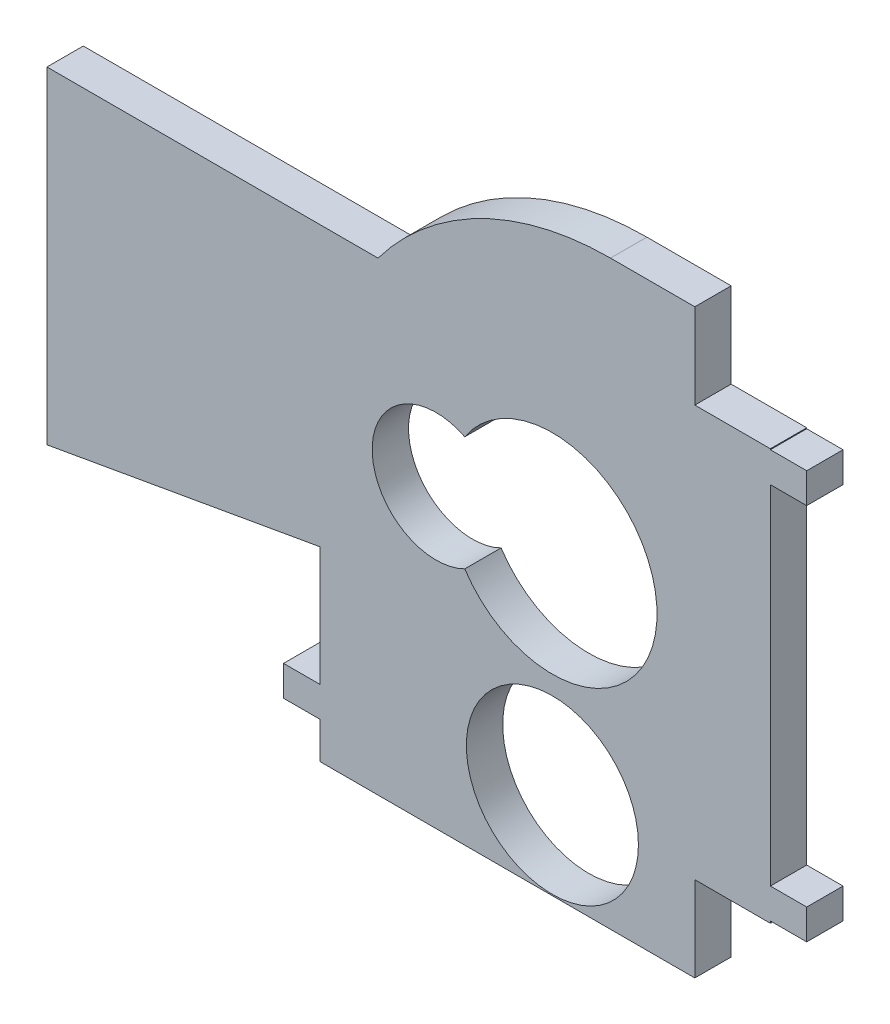
ISO-10303-21;
HEADER;
FILE_DESCRIPTION(('STEP AP214'),'2;1');
FILE_NAME('part.step','',(''),(''),'','','');
FILE_SCHEMA(('AUTOMOTIVE_DESIGN { 1 0 10303 214 1 1 1 1 }'));
ENDSEC;
DATA;
#1=APPLICATION_CONTEXT('core data for automotive mechanical design processes');
#2=APPLICATION_PROTOCOL_DEFINITION('international standard','automotive_design',2000,#1);
#3=PRODUCT_CONTEXT('',#1,'mechanical');
#4=PRODUCT('Part','Part','',(#3));
#5=PRODUCT_RELATED_PRODUCT_CATEGORY('part','',(#4));
#6=PRODUCT_DEFINITION_FORMATION('','',#4);
#7=PRODUCT_DEFINITION_CONTEXT('part definition',#1,'design');
#8=PRODUCT_DEFINITION('design','',#6,#7);
#9=PRODUCT_DEFINITION_SHAPE('','',#8);
#10=(LENGTH_UNIT() NAMED_UNIT(*) SI_UNIT(.MILLI.,.METRE.));
#11=(NAMED_UNIT(*) PLANE_ANGLE_UNIT() SI_UNIT($,.RADIAN.));
#12=(NAMED_UNIT(*) SI_UNIT($,.STERADIAN.) SOLID_ANGLE_UNIT());
#13=UNCERTAINTY_MEASURE_WITH_UNIT(LENGTH_MEASURE(1.E-05),#10,'distance_accuracy_value','');
#14=(GEOMETRIC_REPRESENTATION_CONTEXT(3) GLOBAL_UNCERTAINTY_ASSIGNED_CONTEXT((#13)) GLOBAL_UNIT_ASSIGNED_CONTEXT((#10,
#11,#12)) REPRESENTATION_CONTEXT('',''));
#15=CARTESIAN_POINT('',(0.,0.,0.));
#16=DIRECTION('',(0.,0.,1.));
#17=DIRECTION('',(1.,0.,0.));
#18=AXIS2_PLACEMENT_3D('',#15,#16,#17);
#19=CARTESIAN_POINT('',(-5.48621075951455,-23.7640869080621,1.5875));
#20=DIRECTION('',(0.,0.,1.));
#21=DIRECTION('',(1.,0.,0.));
#22=AXIS2_PLACEMENT_3D('',#19,#20,#21);
#23=PLANE('',#22);
#24=CARTESIAN_POINT('',(-5.08,9.144,1.5875));
#25=DIRECTION('',(0.,0.,1.));
#26=DIRECTION('',(1.,0.,0.));
#27=AXIS2_PLACEMENT_3D('',#24,#25,#26);
#28=CIRCLE('',#27,2.794);
#29=CARTESIAN_POINT('',(-3.82905,11.6423114492593,1.5875));
#30=VERTEX_POINT('',#29);
#31=CARTESIAN_POINT('',(-3.82905,6.64568855074072,1.5875));
#32=VERTEX_POINT('',#31);
#33=EDGE_CURVE('E253',#30,#32,#28,.T.);
#34=ORIENTED_EDGE('',*,*,#33,.F.);
#35=CARTESIAN_POINT('',(0.,9.144,1.5875));
#36=DIRECTION('',(0.,0.,1.));
#37=DIRECTION('',(1.,0.,0.));
#38=AXIS2_PLACEMENT_3D('',#35,#36,#37);
#39=CIRCLE('',#38,4.572);
#40=EDGE_CURVE('E256',#32,#30,#39,.T.);
#41=ORIENTED_EDGE('',*,*,#40,.F.);
#42=EDGE_LOOP('',(#34,#41));
#43=FACE_BOUND('',#42,.T.);
#44=CARTESIAN_POINT('',(0.,0.,1.5875));
#45=DIRECTION('',(0.,0.,1.));
#46=DIRECTION('',(1.,0.,0.));
#47=AXIS2_PLACEMENT_3D('',#44,#45,#46);
#48=CIRCLE('',#47,3.7592);
#49=CARTESIAN_POINT('',(3.7592,0.,1.5875));
#50=VERTEX_POINT('',#49);
#51=EDGE_CURVE('E260',#50,#50,#48,.T.);
#52=ORIENTED_EDGE('',*,*,#51,.F.);
#53=EDGE_LOOP('',(#52));
#54=FACE_BOUND('',#53,.T.);
#55=DIRECTION('',(1.,0.,0.));
#56=VECTOR('',#55,1.);
#57=CARTESIAN_POINT('',(-5.48621075951455,17.8689,1.5875));
#58=LINE('',#57,#56);
#59=CARTESIAN_POINT('',(6.22299999999988,17.8689,1.5875));
#60=VERTEX_POINT('',#59);
#61=CARTESIAN_POINT('',(9.52499999999987,17.8689,1.5875));
#62=VERTEX_POINT('',#61);
#63=EDGE_CURVE('E52',#60,#62,#58,.T.);
#64=ORIENTED_EDGE('',*,*,#63,.F.);
#65=DIRECTION('',(0.,1.,0.));
#66=VECTOR('',#65,1.);
#67=CARTESIAN_POINT('',(6.22299999999989,-23.7640869080621,1.5875));
#68=LINE('',#67,#66);
#69=CARTESIAN_POINT('',(6.22299999999988,21.59,1.5875));
#70=VERTEX_POINT('',#69);
#71=EDGE_CURVE('E215',#60,#70,#68,.T.);
#72=ORIENTED_EDGE('',*,*,#71,.T.);
#73=DIRECTION('',(1.,0.,0.));
#74=VECTOR('',#73,1.);
#75=CARTESIAN_POINT('',(-5.48621075951453,21.59,1.5875));
#76=LINE('',#75,#74);
#77=CARTESIAN_POINT('',(2.53999999999988,21.59,1.5875));
#78=VERTEX_POINT('',#77);
#79=EDGE_CURVE('E263',#78,#70,#76,.T.);
#80=ORIENTED_EDGE('',*,*,#79,.F.);
#81=CARTESIAN_POINT('',(2.53999999999988,8.89,1.5875));
#82=DIRECTION('',(0.,0.,1.));
#83=DIRECTION('',(1.,0.,0.));
#84=AXIS2_PLACEMENT_3D('',#81,#82,#83);
#85=CIRCLE('',#84,12.7);
#86=CARTESIAN_POINT('',(-7.62000000000013,16.51,1.5875));
#87=VERTEX_POINT('',#86);
#88=EDGE_CURVE('E266',#78,#87,#85,.T.);
#89=ORIENTED_EDGE('',*,*,#88,.T.);
#90=DIRECTION('',(-1.,0.,0.));
#91=VECTOR('',#90,1.);
#92=CARTESIAN_POINT('',(-5.48621075951456,16.51,1.5875));
#93=LINE('',#92,#91);
#94=CARTESIAN_POINT('',(-22.0849215190291,16.51,1.5875));
#95=VERTEX_POINT('',#94);
#96=EDGE_CURVE('E269',#87,#95,#93,.T.);
#97=ORIENTED_EDGE('',*,*,#96,.T.);
#98=DIRECTION('',(0.,-1.,0.));
#99=VECTOR('',#98,1.);
#100=CARTESIAN_POINT('',(-22.0849215190291,-23.7640869080621,1.5875));
#101=LINE('',#100,#99);
#102=CARTESIAN_POINT('',(-22.0849215190291,2.2120074123447,1.5875));
#103=VERTEX_POINT('',#102);
#104=EDGE_CURVE('E272',#95,#103,#101,.T.);
#105=ORIENTED_EDGE('',*,*,#104,.T.);
#106=DIRECTION('',(0.984761013296185,0.173913043478257,0.));
#107=VECTOR('',#106,1.);
#108=CARTESIAN_POINT('',(-10.4369894152438,4.26908247425937,1.5875));
#109=LINE('',#108,#107);
#110=CARTESIAN_POINT('',(-10.1600000000001,4.318,1.5875));
#111=VERTEX_POINT('',#110);
#112=EDGE_CURVE('E275',#103,#111,#109,.T.);
#113=ORIENTED_EDGE('',*,*,#112,.T.);
#114=DIRECTION('',(0.,-1.,0.));
#115=VECTOR('',#114,1.);
#116=CARTESIAN_POINT('',(-10.1600000000001,-23.7640869080621,1.5875));
#117=LINE('',#116,#115);
#118=CARTESIAN_POINT('',(-10.1600000000001,-0.889000000000001,1.5875));
#119=VERTEX_POINT('',#118);
#120=EDGE_CURVE('E278',#111,#119,#117,.T.);
#121=ORIENTED_EDGE('',*,*,#120,.T.);
#122=DIRECTION('',(1.,0.,0.));
#123=VECTOR('',#122,1.);
#124=CARTESIAN_POINT('',(-5.48621075951455,-0.889000000000001,1.5875));
#125=LINE('',#124,#123);
#126=CARTESIAN_POINT('',(-11.7475000000001,-0.889000000000001,1.5875));
#127=VERTEX_POINT('',#126);
#128=EDGE_CURVE('E280',#127,#119,#125,.T.);
#129=ORIENTED_EDGE('',*,*,#128,.F.);
#130=DIRECTION('',(0.,1.,0.));
#131=VECTOR('',#130,1.);
#132=CARTESIAN_POINT('',(-11.7475000000001,-23.7640869080621,1.5875));
#133=LINE('',#132,#131);
#134=CARTESIAN_POINT('',(-11.7475000000001,-2.2098,1.5875));
#135=VERTEX_POINT('',#134);
#136=EDGE_CURVE('E284',#135,#127,#133,.T.);
#137=ORIENTED_EDGE('',*,*,#136,.F.);
#138=DIRECTION('',(1.,0.,0.));
#139=VECTOR('',#138,1.);
#140=CARTESIAN_POINT('',(-5.48621075951455,-2.2098,1.5875));
#141=LINE('',#140,#139);
#142=CARTESIAN_POINT('',(-10.1600000000001,-2.2098,1.5875));
#143=VERTEX_POINT('',#142);
#144=EDGE_CURVE('E287',#135,#143,#141,.T.);
#145=ORIENTED_EDGE('',*,*,#144,.T.);
#146=CARTESIAN_POINT('',(-10.1600000000001,-3.81,1.5875));
#147=VERTEX_POINT('',#146);
#148=EDGE_CURVE('E281',#143,#147,#117,.T.);
#149=ORIENTED_EDGE('',*,*,#148,.T.);
#150=DIRECTION('',(1.,0.,0.));
#151=VECTOR('',#150,1.);
#152=CARTESIAN_POINT('',(-5.48621075951455,-3.81,1.5875));
#153=LINE('',#152,#151);
#154=CARTESIAN_POINT('',(6.22299999999988,-3.81,1.5875));
#155=VERTEX_POINT('',#154);
#156=EDGE_CURVE('E290',#147,#155,#153,.T.);
#157=ORIENTED_EDGE('',*,*,#156,.T.);
#158=DIRECTION('',(0.,1.,0.));
#159=VECTOR('',#158,1.);
#160=CARTESIAN_POINT('',(6.22299999999988,-23.7640869080621,1.5875));
#161=LINE('',#160,#159);
#162=CARTESIAN_POINT('',(6.22299999999988,-0.0889000000000133,1.5875));
#163=VERTEX_POINT('',#162);
#164=EDGE_CURVE('E242',#155,#163,#161,.T.);
#165=ORIENTED_EDGE('',*,*,#164,.T.);
#166=DIRECTION('',(1.,0.,0.));
#167=VECTOR('',#166,1.);
#168=CARTESIAN_POINT('',(-5.48621075951455,-0.0889000000000098,1.5875));
#169=LINE('',#168,#167);
#170=CARTESIAN_POINT('',(9.52499999999988,-0.0889000000000098,1.5875));
#171=VERTEX_POINT('',#170);
#172=EDGE_CURVE('E239',#163,#171,#169,.T.);
#173=ORIENTED_EDGE('',*,*,#172,.T.);
#174=DIRECTION('',(0.,-1.,0.));
#175=VECTOR('',#174,1.);
#176=CARTESIAN_POINT('',(9.52499999999988,-23.7640869080621,1.5875));
#177=LINE('',#176,#175);
#178=CARTESIAN_POINT('',(9.52499999999988,0.,1.5875));
#179=VERTEX_POINT('',#178);
#180=EDGE_CURVE('E293',#179,#171,#177,.T.);
#181=ORIENTED_EDGE('',*,*,#180,.F.);
#182=DIRECTION('',(1.,0.,0.));
#183=VECTOR('',#182,1.);
#184=CARTESIAN_POINT('',(-5.48621075951456,0.,1.5875));
#185=LINE('',#184,#183);
#186=CARTESIAN_POINT('',(11.1125,0.,1.5875));
#187=VERTEX_POINT('',#186);
#188=EDGE_CURVE('E296',#179,#187,#185,.T.);
#189=ORIENTED_EDGE('',*,*,#188,.T.);
#190=DIRECTION('',(0.,1.,0.));
#191=VECTOR('',#190,1.);
#192=CARTESIAN_POINT('',(11.1125,-23.7640869080621,1.5875));
#193=LINE('',#192,#191);
#194=CARTESIAN_POINT('',(11.1124999999999,1.3208,1.5875));
#195=VERTEX_POINT('',#194);
#196=EDGE_CURVE('E301',#187,#195,#193,.T.);
#197=ORIENTED_EDGE('',*,*,#196,.T.);
#198=DIRECTION('',(1.,0.,0.));
#199=VECTOR('',#198,1.);
#200=CARTESIAN_POINT('',(-5.48621075951455,1.3208,1.5875));
#201=LINE('',#200,#199);
#202=CARTESIAN_POINT('',(9.52499999999988,1.3208,1.5875));
#203=VERTEX_POINT('',#202);
#204=EDGE_CURVE('E303',#203,#195,#201,.T.);
#205=ORIENTED_EDGE('',*,*,#204,.F.);
#206=CARTESIAN_POINT('',(9.52499999999985,16.51,1.5875));
#207=VERTEX_POINT('',#206);
#208=EDGE_CURVE('E298',#207,#203,#177,.T.);
#209=ORIENTED_EDGE('',*,*,#208,.F.);
#210=DIRECTION('',(1.,0.,0.));
#211=VECTOR('',#210,1.);
#212=CARTESIAN_POINT('',(-5.48621075951455,16.51,1.5875));
#213=LINE('',#212,#211);
#214=CARTESIAN_POINT('',(11.1124999999999,16.51,1.5875));
#215=VERTEX_POINT('',#214);
#216=EDGE_CURVE('E306',#207,#215,#213,.T.);
#217=ORIENTED_EDGE('',*,*,#216,.T.);
#218=DIRECTION('',(0.,1.,0.));
#219=VECTOR('',#218,1.);
#220=CARTESIAN_POINT('',(11.1124999999999,-23.7640869080621,1.5875));
#221=LINE('',#220,#219);
#222=CARTESIAN_POINT('',(11.1124999999999,17.8308,1.5875));
#223=VERTEX_POINT('',#222);
#224=EDGE_CURVE('E309',#215,#223,#221,.T.);
#225=ORIENTED_EDGE('',*,*,#224,.T.);
#226=DIRECTION('',(1.,0.,0.));
#227=VECTOR('',#226,1.);
#228=CARTESIAN_POINT('',(-5.48621075951455,17.8308,1.5875));
#229=LINE('',#228,#227);
#230=CARTESIAN_POINT('',(9.52499999999987,17.8308,1.5875));
#231=VERTEX_POINT('',#230);
#232=EDGE_CURVE('E311',#231,#223,#229,.T.);
#233=ORIENTED_EDGE('',*,*,#232,.F.);
#234=EDGE_CURVE('E297',#62,#231,#177,.T.);
#235=ORIENTED_EDGE('',*,*,#234,.F.);
#236=EDGE_LOOP('',(#64,#72,#80,#89,#97,#105,#113,#121,#129,#137,#145,#149,#157,#165,#173,#181,
#189,#197,#205,#209,#217,#225,#233,#235));
#237=FACE_BOUND('',#236,.T.);
#238=ADVANCED_FACE('F35',(#43,#54,#237),#23,.T.);
#239=CARTESIAN_POINT('',(-5.48621075951455,-23.7640869080621,0.));
#240=DIRECTION('',(0.,0.,1.));
#241=DIRECTION('',(1.,0.,0.));
#242=AXIS2_PLACEMENT_3D('',#239,#240,#241);
#243=PLANE('',#242);
#244=CARTESIAN_POINT('',(-5.08,9.144,0.));
#245=DIRECTION('',(0.,0.,1.));
#246=DIRECTION('',(1.,0.,0.));
#247=AXIS2_PLACEMENT_3D('',#244,#245,#246);
#248=CIRCLE('',#247,2.794);
#249=CARTESIAN_POINT('',(-3.82905,11.6423114492593,0.));
#250=VERTEX_POINT('',#249);
#251=CARTESIAN_POINT('',(-3.82905,6.64568855074072,0.));
#252=VERTEX_POINT('',#251);
#253=EDGE_CURVE('E252',#250,#252,#248,.T.);
#254=ORIENTED_EDGE('',*,*,#253,.T.);
#255=CARTESIAN_POINT('',(0.,9.144,0.));
#256=DIRECTION('',(0.,0.,1.));
#257=DIRECTION('',(1.,0.,0.));
#258=AXIS2_PLACEMENT_3D('',#255,#256,#257);
#259=CIRCLE('',#258,4.572);
#260=EDGE_CURVE('E316',#252,#250,#259,.T.);
#261=ORIENTED_EDGE('',*,*,#260,.T.);
#262=EDGE_LOOP('',(#254,#261));
#263=FACE_BOUND('',#262,.T.);
#264=CARTESIAN_POINT('',(0.,0.,0.));
#265=DIRECTION('',(0.,0.,1.));
#266=DIRECTION('',(1.,0.,0.));
#267=AXIS2_PLACEMENT_3D('',#264,#265,#266);
#268=CIRCLE('',#267,3.7592);
#269=CARTESIAN_POINT('',(3.7592,0.,0.));
#270=VERTEX_POINT('',#269);
#271=EDGE_CURVE('E319',#270,#270,#268,.T.);
#272=ORIENTED_EDGE('',*,*,#271,.T.);
#273=EDGE_LOOP('',(#272));
#274=FACE_BOUND('',#273,.T.);
#275=DIRECTION('',(0.,-1.,0.));
#276=VECTOR('',#275,1.);
#277=CARTESIAN_POINT('',(6.22299999999989,-23.7640869080621,0.));
#278=LINE('',#277,#276);
#279=CARTESIAN_POINT('',(6.22299999999988,21.59,0.));
#280=VERTEX_POINT('',#279);
#281=CARTESIAN_POINT('',(6.22299999999988,17.8689,0.));
#282=VERTEX_POINT('',#281);
#283=EDGE_CURVE('E212',#280,#282,#278,.T.);
#284=ORIENTED_EDGE('',*,*,#283,.T.);
#285=DIRECTION('',(-1.,0.,0.));
#286=VECTOR('',#285,1.);
#287=CARTESIAN_POINT('',(-5.48621075951455,17.8689,0.));
#288=LINE('',#287,#286);
#289=CARTESIAN_POINT('',(9.52499999999988,17.8689,0.));
#290=VERTEX_POINT('',#289);
#291=EDGE_CURVE('E219',#290,#282,#288,.T.);
#292=ORIENTED_EDGE('',*,*,#291,.F.);
#293=DIRECTION('',(0.,-1.,0.));
#294=VECTOR('',#293,1.);
#295=CARTESIAN_POINT('',(9.52499999999988,-23.7640869080621,0.));
#296=LINE('',#295,#294);
#297=CARTESIAN_POINT('',(9.52499999999987,17.8308,0.));
#298=VERTEX_POINT('',#297);
#299=EDGE_CURVE('E257',#290,#298,#296,.T.);
#300=ORIENTED_EDGE('',*,*,#299,.T.);
#301=DIRECTION('',(1.,0.,0.));
#302=VECTOR('',#301,1.);
#303=CARTESIAN_POINT('',(-5.48621075951455,17.8308,0.));
#304=LINE('',#303,#302);
#305=CARTESIAN_POINT('',(11.1124999999999,17.8308,0.));
#306=VERTEX_POINT('',#305);
#307=EDGE_CURVE('E370',#298,#306,#304,.T.);
#308=ORIENTED_EDGE('',*,*,#307,.T.);
#309=DIRECTION('',(0.,1.,0.));
#310=VECTOR('',#309,1.);
#311=CARTESIAN_POINT('',(11.1124999999999,-23.7640869080621,0.));
#312=LINE('',#311,#310);
#313=CARTESIAN_POINT('',(11.1124999999999,16.51,0.));
#314=VERTEX_POINT('',#313);
#315=EDGE_CURVE('E367',#314,#306,#312,.T.);
#316=ORIENTED_EDGE('',*,*,#315,.F.);
#317=DIRECTION('',(1.,0.,0.));
#318=VECTOR('',#317,1.);
#319=CARTESIAN_POINT('',(-5.48621075951455,16.51,0.));
#320=LINE('',#319,#318);
#321=CARTESIAN_POINT('',(9.52499999999985,16.51,0.));
#322=VERTEX_POINT('',#321);
#323=EDGE_CURVE('E364',#322,#314,#320,.T.);
#324=ORIENTED_EDGE('',*,*,#323,.F.);
#325=CARTESIAN_POINT('',(9.52499999999988,1.3208,0.));
#326=VERTEX_POINT('',#325);
#327=EDGE_CURVE('E355',#322,#326,#296,.T.);
#328=ORIENTED_EDGE('',*,*,#327,.T.);
#329=DIRECTION('',(1.,0.,0.));
#330=VECTOR('',#329,1.);
#331=CARTESIAN_POINT('',(-5.48621075951455,1.3208,0.));
#332=LINE('',#331,#330);
#333=CARTESIAN_POINT('',(11.1124999999999,1.3208,0.));
#334=VERTEX_POINT('',#333);
#335=EDGE_CURVE('E361',#326,#334,#332,.T.);
#336=ORIENTED_EDGE('',*,*,#335,.T.);
#337=DIRECTION('',(0.,1.,0.));
#338=VECTOR('',#337,1.);
#339=CARTESIAN_POINT('',(11.1125,-23.7640869080621,0.));
#340=LINE('',#339,#338);
#341=CARTESIAN_POINT('',(11.1125,0.,0.));
#342=VERTEX_POINT('',#341);
#343=EDGE_CURVE('E358',#342,#334,#340,.T.);
#344=ORIENTED_EDGE('',*,*,#343,.F.);
#345=DIRECTION('',(1.,0.,0.));
#346=VECTOR('',#345,1.);
#347=CARTESIAN_POINT('',(-5.48621075951456,0.,0.));
#348=LINE('',#347,#346);
#349=CARTESIAN_POINT('',(9.52499999999988,0.,0.));
#350=VERTEX_POINT('',#349);
#351=EDGE_CURVE('E354',#350,#342,#348,.T.);
#352=ORIENTED_EDGE('',*,*,#351,.F.);
#353=CARTESIAN_POINT('',(9.52499999999988,-0.0889000000000098,0.));
#354=VERTEX_POINT('',#353);
#355=EDGE_CURVE('E351',#350,#354,#296,.T.);
#356=ORIENTED_EDGE('',*,*,#355,.T.);
#357=DIRECTION('',(-1.,0.,0.));
#358=VECTOR('',#357,1.);
#359=CARTESIAN_POINT('',(-5.48621075951455,-0.0889000000000098,0.));
#360=LINE('',#359,#358);
#361=CARTESIAN_POINT('',(6.22299999999988,-0.0889000000000133,0.));
#362=VERTEX_POINT('',#361);
#363=EDGE_CURVE('E223',#354,#362,#360,.T.);
#364=ORIENTED_EDGE('',*,*,#363,.T.);
#365=DIRECTION('',(0.,-1.,0.));
#366=VECTOR('',#365,1.);
#367=CARTESIAN_POINT('',(6.22299999999988,-23.7640869080621,0.));
#368=LINE('',#367,#366);
#369=CARTESIAN_POINT('',(6.22299999999988,-3.81,0.));
#370=VERTEX_POINT('',#369);
#371=EDGE_CURVE('E248',#362,#370,#368,.T.);
#372=ORIENTED_EDGE('',*,*,#371,.T.);
#373=DIRECTION('',(1.,0.,0.));
#374=VECTOR('',#373,1.);
#375=CARTESIAN_POINT('',(-5.48621075951455,-3.81,0.));
#376=LINE('',#375,#374);
#377=CARTESIAN_POINT('',(-10.1600000000001,-3.81,0.));
#378=VERTEX_POINT('',#377);
#379=EDGE_CURVE('E348',#378,#370,#376,.T.);
#380=ORIENTED_EDGE('',*,*,#379,.F.);
#381=DIRECTION('',(0.,-1.,0.));
#382=VECTOR('',#381,1.);
#383=CARTESIAN_POINT('',(-10.1600000000001,-23.7640869080621,0.));
#384=LINE('',#383,#382);
#385=CARTESIAN_POINT('',(-10.1600000000001,-2.2098,0.));
#386=VERTEX_POINT('',#385);
#387=EDGE_CURVE('E339',#386,#378,#384,.T.);
#388=ORIENTED_EDGE('',*,*,#387,.F.);
#389=DIRECTION('',(1.,0.,0.));
#390=VECTOR('',#389,1.);
#391=CARTESIAN_POINT('',(-5.48621075951455,-2.2098,0.));
#392=LINE('',#391,#390);
#393=CARTESIAN_POINT('',(-11.7475000000001,-2.2098,0.));
#394=VERTEX_POINT('',#393);
#395=EDGE_CURVE('E345',#394,#386,#392,.T.);
#396=ORIENTED_EDGE('',*,*,#395,.F.);
#397=DIRECTION('',(0.,1.,0.));
#398=VECTOR('',#397,1.);
#399=CARTESIAN_POINT('',(-11.7475000000001,-23.7640869080621,0.));
#400=LINE('',#399,#398);
#401=CARTESIAN_POINT('',(-11.7475000000001,-0.889000000000001,0.));
#402=VERTEX_POINT('',#401);
#403=EDGE_CURVE('E342',#394,#402,#400,.T.);
#404=ORIENTED_EDGE('',*,*,#403,.T.);
#405=DIRECTION('',(1.,0.,0.));
#406=VECTOR('',#405,1.);
#407=CARTESIAN_POINT('',(-5.48621075951455,-0.889000000000001,0.));
#408=LINE('',#407,#406);
#409=CARTESIAN_POINT('',(-10.1600000000001,-0.889000000000001,0.));
#410=VERTEX_POINT('',#409);
#411=EDGE_CURVE('E338',#402,#410,#408,.T.);
#412=ORIENTED_EDGE('',*,*,#411,.T.);
#413=CARTESIAN_POINT('',(-10.1600000000001,4.318,0.));
#414=VERTEX_POINT('',#413);
#415=EDGE_CURVE('E335',#414,#410,#384,.T.);
#416=ORIENTED_EDGE('',*,*,#415,.F.);
#417=DIRECTION('',(0.984761013296185,0.173913043478257,0.));
#418=VECTOR('',#417,1.);
#419=CARTESIAN_POINT('',(-10.4369894152438,4.26908247425937,0.));
#420=LINE('',#419,#418);
#421=CARTESIAN_POINT('',(-22.0849215190291,2.2120074123447,0.));
#422=VERTEX_POINT('',#421);
#423=EDGE_CURVE('E332',#422,#414,#420,.T.);
#424=ORIENTED_EDGE('',*,*,#423,.F.);
#425=DIRECTION('',(0.,-1.,0.));
#426=VECTOR('',#425,1.);
#427=CARTESIAN_POINT('',(-22.0849215190291,-23.7640869080621,0.));
#428=LINE('',#427,#426);
#429=CARTESIAN_POINT('',(-22.0849215190291,16.51,0.));
#430=VERTEX_POINT('',#429);
#431=EDGE_CURVE('E329',#430,#422,#428,.T.);
#432=ORIENTED_EDGE('',*,*,#431,.F.);
#433=DIRECTION('',(-1.,0.,0.));
#434=VECTOR('',#433,1.);
#435=CARTESIAN_POINT('',(-5.48621075951456,16.51,0.));
#436=LINE('',#435,#434);
#437=CARTESIAN_POINT('',(-7.62000000000013,16.51,0.));
#438=VERTEX_POINT('',#437);
#439=EDGE_CURVE('E326',#438,#430,#436,.T.);
#440=ORIENTED_EDGE('',*,*,#439,.F.);
#441=CARTESIAN_POINT('',(2.53999999999988,8.89,0.));
#442=DIRECTION('',(0.,0.,1.));
#443=DIRECTION('',(1.,0.,0.));
#444=AXIS2_PLACEMENT_3D('',#441,#442,#443);
#445=CIRCLE('',#444,12.7);
#446=CARTESIAN_POINT('',(2.53999999999988,21.59,0.));
#447=VERTEX_POINT('',#446);
#448=EDGE_CURVE('E323',#447,#438,#445,.T.);
#449=ORIENTED_EDGE('',*,*,#448,.F.);
#450=DIRECTION('',(1.,0.,0.));
#451=VECTOR('',#450,1.);
#452=CARTESIAN_POINT('',(-5.48621075951453,21.59,0.));
#453=LINE('',#452,#451);
#454=EDGE_CURVE('E230',#447,#280,#453,.T.);
#455=ORIENTED_EDGE('',*,*,#454,.T.);
#456=EDGE_LOOP('',(#284,#292,#300,#308,#316,#324,#328,#336,#344,#352,#356,#364,#372,#380,#388,
#396,#404,#412,#416,#424,#432,#440,#449,#455));
#457=FACE_BOUND('',#456,.T.);
#458=ADVANCED_FACE('F227',(#263,#274,#457),#243,.F.);
#459=CARTESIAN_POINT('',(-5.48621075951453,21.59,1.5875));
#460=DIRECTION('',(0.,1.,0.));
#461=DIRECTION('',(-1.,0.,0.));
#462=AXIS2_PLACEMENT_3D('',#459,#460,#461);
#463=PLANE('',#462);
#464=ORIENTED_EDGE('',*,*,#79,.T.);
#465=DIRECTION('',(0.,0.,1.));
#466=VECTOR('',#465,1.);
#467=CARTESIAN_POINT('',(6.22299999999988,21.59,-0.000999999999999916));
#468=LINE('',#467,#466);
#469=EDGE_CURVE('E224',#280,#70,#468,.T.);
#470=ORIENTED_EDGE('',*,*,#469,.F.);
#471=ORIENTED_EDGE('',*,*,#454,.F.);
#472=DIRECTION('',(0.,0.,-1.));
#473=VECTOR('',#472,1.);
#474=CARTESIAN_POINT('',(2.53999999999988,21.59,1.5875));
#475=LINE('',#474,#473);
#476=EDGE_CURVE('E11',#78,#447,#475,.T.);
#477=ORIENTED_EDGE('',*,*,#476,.F.);
#478=EDGE_LOOP('',(#464,#470,#471,#477));
#479=FACE_BOUND('',#478,.T.);
#480=ADVANCED_FACE('F461',(#479),#463,.T.);
#481=CARTESIAN_POINT('',(-5.48621075951455,-3.81,1.5875));
#482=DIRECTION('',(0.,1.,0.));
#483=DIRECTION('',(0.,0.,1.));
#484=AXIS2_PLACEMENT_3D('',#481,#482,#483);
#485=PLANE('',#484);
#486=DIRECTION('',(0.,0.,1.));
#487=VECTOR('',#486,1.);
#488=CARTESIAN_POINT('',(6.22299999999988,-3.81,-0.000999999999999916));
#489=LINE('',#488,#487);
#490=EDGE_CURVE('E60',#370,#155,#489,.T.);
#491=ORIENTED_EDGE('',*,*,#490,.T.);
#492=ORIENTED_EDGE('',*,*,#156,.F.);
#493=DIRECTION('',(0.,0.,-1.));
#494=VECTOR('',#493,1.);
#495=CARTESIAN_POINT('',(-10.1600000000001,-3.81,1.5875));
#496=LINE('',#495,#494);
#497=EDGE_CURVE('E392',#147,#378,#496,.T.);
#498=ORIENTED_EDGE('',*,*,#497,.T.);
#499=ORIENTED_EDGE('',*,*,#379,.T.);
#500=EDGE_LOOP('',(#491,#492,#498,#499));
#501=FACE_BOUND('',#500,.T.);
#502=ADVANCED_FACE('F492',(#501),#485,.F.);
#503=CARTESIAN_POINT('',(9.52499999999988,-23.7640869080621,1.5875));
#504=DIRECTION('',(1.,0.,0.));
#505=DIRECTION('',(0.,1.,0.));
#506=AXIS2_PLACEMENT_3D('',#503,#504,#505);
#507=PLANE('',#506);
#508=ORIENTED_EDGE('',*,*,#180,.T.);
#509=DIRECTION('',(0.,0.,1.));
#510=VECTOR('',#509,1.);
#511=CARTESIAN_POINT('',(9.52499999999988,-0.0889000000000098,-0.000999999999999916));
#512=LINE('',#511,#510);
#513=EDGE_CURVE('E246',#354,#171,#512,.T.);
#514=ORIENTED_EDGE('',*,*,#513,.F.);
#515=ORIENTED_EDGE('',*,*,#355,.F.);
#516=DIRECTION('',(0.,0.,-1.));
#517=VECTOR('',#516,1.);
#518=CARTESIAN_POINT('',(9.52499999999988,0.,1.5875));
#519=LINE('',#518,#517);
#520=EDGE_CURVE('E390',#179,#350,#519,.T.);
#521=ORIENTED_EDGE('',*,*,#520,.F.);
#522=EDGE_LOOP('',(#508,#514,#515,#521));
#523=FACE_BOUND('',#522,.T.);
#524=ADVANCED_FACE('F453',(#523),#507,.T.);
#525=CARTESIAN_POINT('',(2.53999999999988,8.89,1.5875));
#526=DIRECTION('',(0.,0.,-1.));
#527=DIRECTION('',(-1.,0.,0.));
#528=AXIS2_PLACEMENT_3D('',#525,#526,#527);
#529=CYLINDRICAL_SURFACE('',#528,12.7);
#530=ORIENTED_EDGE('',*,*,#448,.T.);
#531=DIRECTION('',(0.,0.,-1.));
#532=VECTOR('',#531,1.);
#533=CARTESIAN_POINT('',(-7.62000000000013,16.51,1.5875));
#534=LINE('',#533,#532);
#535=EDGE_CURVE('E44',#87,#438,#534,.T.);
#536=ORIENTED_EDGE('',*,*,#535,.F.);
#537=ORIENTED_EDGE('',*,*,#88,.F.);
#538=ORIENTED_EDGE('',*,*,#476,.T.);
#539=EDGE_LOOP('',(#530,#536,#537,#538));
#540=FACE_BOUND('',#539,.T.);
#541=ADVANCED_FACE('F494',(#540),#529,.T.);
#542=CARTESIAN_POINT('',(-5.48621075951456,16.51,1.5875));
#543=DIRECTION('',(0.,-1.,0.));
#544=DIRECTION('',(1.,0.,0.));
#545=AXIS2_PLACEMENT_3D('',#542,#543,#544);
#546=PLANE('',#545);
#547=ORIENTED_EDGE('',*,*,#439,.T.);
#548=DIRECTION('',(0.,0.,-1.));
#549=VECTOR('',#548,1.);
#550=CARTESIAN_POINT('',(-22.0849215190291,16.51,1.5875));
#551=LINE('',#550,#549);
#552=EDGE_CURVE('E410',#95,#430,#551,.T.);
#553=ORIENTED_EDGE('',*,*,#552,.F.);
#554=ORIENTED_EDGE('',*,*,#96,.F.);
#555=ORIENTED_EDGE('',*,*,#535,.T.);
#556=EDGE_LOOP('',(#547,#553,#554,#555));
#557=FACE_BOUND('',#556,.T.);
#558=ADVANCED_FACE('F497',(#557),#546,.F.);
#559=CARTESIAN_POINT('',(-22.0849215190291,-23.7640869080621,1.5875));
#560=DIRECTION('',(1.,0.,0.));
#561=DIRECTION('',(0.,1.,0.));
#562=AXIS2_PLACEMENT_3D('',#559,#560,#561);
#563=PLANE('',#562);
#564=ORIENTED_EDGE('',*,*,#431,.T.);
#565=DIRECTION('',(0.,0.,-1.));
#566=VECTOR('',#565,1.);
#567=CARTESIAN_POINT('',(-22.0849215190291,2.2120074123447,1.5875));
#568=LINE('',#567,#566);
#569=EDGE_CURVE('E407',#103,#422,#568,.T.);
#570=ORIENTED_EDGE('',*,*,#569,.F.);
#571=ORIENTED_EDGE('',*,*,#104,.F.);
#572=ORIENTED_EDGE('',*,*,#552,.T.);
#573=EDGE_LOOP('',(#564,#570,#571,#572));
#574=FACE_BOUND('',#573,.T.);
#575=ADVANCED_FACE('F501',(#574),#563,.F.);
#576=CARTESIAN_POINT('',(-10.4369894152438,4.26908247425937,1.5875));
#577=DIRECTION('',(-0.173913043478257,0.984761013296185,0.));
#578=DIRECTION('',(-0.984761013296185,-0.173913043478257,0.));
#579=AXIS2_PLACEMENT_3D('',#576,#577,#578);
#580=PLANE('',#579);
#581=ORIENTED_EDGE('',*,*,#423,.T.);
#582=DIRECTION('',(0.,0.,-1.));
#583=VECTOR('',#582,1.);
#584=CARTESIAN_POINT('',(-10.1600000000001,4.318,1.5875));
#585=LINE('',#584,#583);
#586=EDGE_CURVE('E404',#111,#414,#585,.T.);
#587=ORIENTED_EDGE('',*,*,#586,.F.);
#588=ORIENTED_EDGE('',*,*,#112,.F.);
#589=ORIENTED_EDGE('',*,*,#569,.T.);
#590=EDGE_LOOP('',(#581,#587,#588,#589));
#591=FACE_BOUND('',#590,.T.);
#592=ADVANCED_FACE('F505',(#591),#580,.F.);
#593=CARTESIAN_POINT('',(-10.1600000000001,-23.7640869080621,1.5875));
#594=DIRECTION('',(1.,0.,0.));
#595=DIRECTION('',(0.,1.,0.));
#596=AXIS2_PLACEMENT_3D('',#593,#594,#595);
#597=PLANE('',#596);
#598=ORIENTED_EDGE('',*,*,#415,.T.);
#599=DIRECTION('',(0.,0.,-1.));
#600=VECTOR('',#599,1.);
#601=CARTESIAN_POINT('',(-10.1600000000001,-0.889000000000001,1.5875));
#602=LINE('',#601,#600);
#603=EDGE_CURVE('E402',#119,#410,#602,.T.);
#604=ORIENTED_EDGE('',*,*,#603,.F.);
#605=ORIENTED_EDGE('',*,*,#120,.F.);
#606=ORIENTED_EDGE('',*,*,#586,.T.);
#607=EDGE_LOOP('',(#598,#604,#605,#606));
#608=FACE_BOUND('',#607,.T.);
#609=ADVANCED_FACE('F509',(#608),#597,.F.);
#610=CARTESIAN_POINT('',(-5.48621075951455,-0.889000000000001,1.5875));
#611=DIRECTION('',(0.,1.,0.));
#612=DIRECTION('',(0.,0.,1.));
#613=AXIS2_PLACEMENT_3D('',#610,#611,#612);
#614=PLANE('',#613);
#615=ORIENTED_EDGE('',*,*,#411,.F.);
#616=DIRECTION('',(0.,0.,-1.));
#617=VECTOR('',#616,1.);
#618=CARTESIAN_POINT('',(-11.7475000000001,-0.889000000000001,1.5875));
#619=LINE('',#618,#617);
#620=EDGE_CURVE('E400',#127,#402,#619,.T.);
#621=ORIENTED_EDGE('',*,*,#620,.F.);
#622=ORIENTED_EDGE('',*,*,#128,.T.);
#623=ORIENTED_EDGE('',*,*,#603,.T.);
#624=EDGE_LOOP('',(#615,#621,#622,#623));
#625=FACE_BOUND('',#624,.T.);
#626=ADVANCED_FACE('F511',(#625),#614,.T.);
#627=CARTESIAN_POINT('',(-11.7475000000001,-23.7640869080621,1.5875));
#628=DIRECTION('',(-1.,0.,0.));
#629=DIRECTION('',(0.,-1.,0.));
#630=AXIS2_PLACEMENT_3D('',#627,#628,#629);
#631=PLANE('',#630);
#632=ORIENTED_EDGE('',*,*,#403,.F.);
#633=DIRECTION('',(0.,0.,-1.));
#634=VECTOR('',#633,1.);
#635=CARTESIAN_POINT('',(-11.7475000000001,-2.2098,1.5875));
#636=LINE('',#635,#634);
#637=EDGE_CURVE('E398',#135,#394,#636,.T.);
#638=ORIENTED_EDGE('',*,*,#637,.F.);
#639=ORIENTED_EDGE('',*,*,#136,.T.);
#640=ORIENTED_EDGE('',*,*,#620,.T.);
#641=EDGE_LOOP('',(#632,#638,#639,#640));
#642=FACE_BOUND('',#641,.T.);
#643=ADVANCED_FACE('F514',(#642),#631,.T.);
#644=CARTESIAN_POINT('',(-5.48621075951455,-2.2098,1.5875));
#645=DIRECTION('',(0.,1.,0.));
#646=DIRECTION('',(0.,0.,1.));
#647=AXIS2_PLACEMENT_3D('',#644,#645,#646);
#648=PLANE('',#647);
#649=ORIENTED_EDGE('',*,*,#395,.T.);
#650=DIRECTION('',(0.,0.,-1.));
#651=VECTOR('',#650,1.);
#652=CARTESIAN_POINT('',(-10.1600000000001,-2.2098,1.5875));
#653=LINE('',#652,#651);
#654=EDGE_CURVE('E395',#143,#386,#653,.T.);
#655=ORIENTED_EDGE('',*,*,#654,.F.);
#656=ORIENTED_EDGE('',*,*,#144,.F.);
#657=ORIENTED_EDGE('',*,*,#637,.T.);
#658=EDGE_LOOP('',(#649,#655,#656,#657));
#659=FACE_BOUND('',#658,.T.);
#660=ADVANCED_FACE('F518',(#659),#648,.F.);
#661=ORIENTED_EDGE('',*,*,#387,.T.);
#662=ORIENTED_EDGE('',*,*,#497,.F.);
#663=ORIENTED_EDGE('',*,*,#148,.F.);
#664=ORIENTED_EDGE('',*,*,#654,.T.);
#665=EDGE_LOOP('',(#661,#662,#663,#664));
#666=FACE_BOUND('',#665,.T.);
#667=ADVANCED_FACE('F522',(#666),#597,.F.);
#668=CARTESIAN_POINT('',(-5.48621075951456,0.,1.5875));
#669=DIRECTION('',(0.,1.,0.));
#670=DIRECTION('',(-1.,0.,0.));
#671=AXIS2_PLACEMENT_3D('',#668,#669,#670);
#672=PLANE('',#671);
#673=ORIENTED_EDGE('',*,*,#351,.T.);
#674=DIRECTION('',(0.,0.,-1.));
#675=VECTOR('',#674,1.);
#676=CARTESIAN_POINT('',(11.1125,0.,1.5875));
#677=LINE('',#676,#675);
#678=EDGE_CURVE('E387',#187,#342,#677,.T.);
#679=ORIENTED_EDGE('',*,*,#678,.F.);
#680=ORIENTED_EDGE('',*,*,#188,.F.);
#681=ORIENTED_EDGE('',*,*,#520,.T.);
#682=EDGE_LOOP('',(#673,#679,#680,#681));
#683=FACE_BOUND('',#682,.T.);
#684=ADVANCED_FACE('F526',(#683),#672,.F.);
#685=CARTESIAN_POINT('',(11.1125,-23.7640869080621,1.5875));
#686=DIRECTION('',(-1.,0.,0.));
#687=DIRECTION('',(0.,0.,1.));
#688=AXIS2_PLACEMENT_3D('',#685,#686,#687);
#689=PLANE('',#688);
#690=ORIENTED_EDGE('',*,*,#343,.T.);
#691=DIRECTION('',(0.,0.,-1.));
#692=VECTOR('',#691,1.);
#693=CARTESIAN_POINT('',(11.1124999999999,1.3208,1.5875));
#694=LINE('',#693,#692);
#695=EDGE_CURVE('E385',#195,#334,#694,.T.);
#696=ORIENTED_EDGE('',*,*,#695,.F.);
#697=ORIENTED_EDGE('',*,*,#196,.F.);
#698=ORIENTED_EDGE('',*,*,#678,.T.);
#699=EDGE_LOOP('',(#690,#696,#697,#698));
#700=FACE_BOUND('',#699,.T.);
#701=ADVANCED_FACE('F533',(#700),#689,.F.);
#702=CARTESIAN_POINT('',(-5.48621075951455,1.3208,1.5875));
#703=DIRECTION('',(0.,1.,0.));
#704=DIRECTION('',(0.,0.,1.));
#705=AXIS2_PLACEMENT_3D('',#702,#703,#704);
#706=PLANE('',#705);
#707=ORIENTED_EDGE('',*,*,#335,.F.);
#708=DIRECTION('',(0.,0.,-1.));
#709=VECTOR('',#708,1.);
#710=CARTESIAN_POINT('',(9.52499999999988,1.3208,1.5875));
#711=LINE('',#710,#709);
#712=EDGE_CURVE('E383',#203,#326,#711,.T.);
#713=ORIENTED_EDGE('',*,*,#712,.F.);
#714=ORIENTED_EDGE('',*,*,#204,.T.);
#715=ORIENTED_EDGE('',*,*,#695,.T.);
#716=EDGE_LOOP('',(#707,#713,#714,#715));
#717=FACE_BOUND('',#716,.T.);
#718=ADVANCED_FACE('F432',(#717),#706,.T.);
#719=ORIENTED_EDGE('',*,*,#327,.F.);
#720=DIRECTION('',(0.,0.,-1.));
#721=VECTOR('',#720,1.);
#722=CARTESIAN_POINT('',(9.52499999999985,16.51,1.5875));
#723=LINE('',#722,#721);
#724=EDGE_CURVE('E381',#207,#322,#723,.T.);
#725=ORIENTED_EDGE('',*,*,#724,.F.);
#726=ORIENTED_EDGE('',*,*,#208,.T.);
#727=ORIENTED_EDGE('',*,*,#712,.T.);
#728=EDGE_LOOP('',(#719,#725,#726,#727));
#729=FACE_BOUND('',#728,.T.);
#730=ADVANCED_FACE('F424',(#729),#507,.T.);
#731=CARTESIAN_POINT('',(-5.48621075951455,16.51,1.5875));
#732=DIRECTION('',(0.,1.,0.));
#733=DIRECTION('',(0.,0.,1.));
#734=AXIS2_PLACEMENT_3D('',#731,#732,#733);
#735=PLANE('',#734);
#736=ORIENTED_EDGE('',*,*,#323,.T.);
#737=DIRECTION('',(0.,0.,-1.));
#738=VECTOR('',#737,1.);
#739=CARTESIAN_POINT('',(11.1124999999999,16.51,1.5875));
#740=LINE('',#739,#738);
#741=EDGE_CURVE('E378',#215,#314,#740,.T.);
#742=ORIENTED_EDGE('',*,*,#741,.F.);
#743=ORIENTED_EDGE('',*,*,#216,.F.);
#744=ORIENTED_EDGE('',*,*,#724,.T.);
#745=EDGE_LOOP('',(#736,#742,#743,#744));
#746=FACE_BOUND('',#745,.T.);
#747=ADVANCED_FACE('F444',(#746),#735,.F.);
#748=CARTESIAN_POINT('',(11.1124999999999,-23.7640869080621,1.5875));
#749=DIRECTION('',(-1.,0.,0.));
#750=DIRECTION('',(0.,0.,1.));
#751=AXIS2_PLACEMENT_3D('',#748,#749,#750);
#752=PLANE('',#751);
#753=ORIENTED_EDGE('',*,*,#315,.T.);
#754=DIRECTION('',(0.,0.,-1.));
#755=VECTOR('',#754,1.);
#756=CARTESIAN_POINT('',(11.1124999999999,17.8308,1.5875));
#757=LINE('',#756,#755);
#758=EDGE_CURVE('E376',#223,#306,#757,.T.);
#759=ORIENTED_EDGE('',*,*,#758,.F.);
#760=ORIENTED_EDGE('',*,*,#224,.F.);
#761=ORIENTED_EDGE('',*,*,#741,.T.);
#762=EDGE_LOOP('',(#753,#759,#760,#761));
#763=FACE_BOUND('',#762,.T.);
#764=ADVANCED_FACE('F442',(#763),#752,.F.);
#765=CARTESIAN_POINT('',(-5.48621075951455,17.8308,1.5875));
#766=DIRECTION('',(0.,1.,0.));
#767=DIRECTION('',(0.,0.,1.));
#768=AXIS2_PLACEMENT_3D('',#765,#766,#767);
#769=PLANE('',#768);
#770=ORIENTED_EDGE('',*,*,#307,.F.);
#771=DIRECTION('',(0.,0.,-1.));
#772=VECTOR('',#771,1.);
#773=CARTESIAN_POINT('',(9.52499999999987,17.8308,1.5875));
#774=LINE('',#773,#772);
#775=EDGE_CURVE('E373',#231,#298,#774,.T.);
#776=ORIENTED_EDGE('',*,*,#775,.F.);
#777=ORIENTED_EDGE('',*,*,#232,.T.);
#778=ORIENTED_EDGE('',*,*,#758,.T.);
#779=EDGE_LOOP('',(#770,#776,#777,#778));
#780=FACE_BOUND('',#779,.T.);
#781=ADVANCED_FACE('F439',(#780),#769,.T.);
#782=CARTESIAN_POINT('',(-5.08,9.144,1.5875));
#783=DIRECTION('',(0.,0.,-1.));
#784=DIRECTION('',(-1.,0.,0.));
#785=AXIS2_PLACEMENT_3D('',#782,#783,#784);
#786=CYLINDRICAL_SURFACE('',#785,2.794);
#787=ORIENTED_EDGE('',*,*,#253,.F.);
#788=DIRECTION('',(0.,0.,-1.));
#789=VECTOR('',#788,1.);
#790=CARTESIAN_POINT('',(-3.82905,11.6423114492593,1.5875));
#791=LINE('',#790,#789);
#792=EDGE_CURVE('E39',#30,#250,#791,.T.);
#793=ORIENTED_EDGE('',*,*,#792,.F.);
#794=ORIENTED_EDGE('',*,*,#33,.T.);
#795=DIRECTION('',(0.,0.,-1.));
#796=VECTOR('',#795,1.);
#797=CARTESIAN_POINT('',(-3.82905,6.64568855074072,1.5875));
#798=LINE('',#797,#796);
#799=EDGE_CURVE('E414',#32,#252,#798,.T.);
#800=ORIENTED_EDGE('',*,*,#799,.T.);
#801=EDGE_LOOP('',(#787,#793,#794,#800));
#802=FACE_BOUND('',#801,.T.);
#803=ADVANCED_FACE('F37',(#802),#786,.F.);
#804=CARTESIAN_POINT('',(0.,0.,1.5875));
#805=DIRECTION('',(0.,0.,-1.));
#806=DIRECTION('',(-1.,0.,0.));
#807=AXIS2_PLACEMENT_3D('',#804,#805,#806);
#808=CYLINDRICAL_SURFACE('',#807,3.7592);
#809=ORIENTED_EDGE('',*,*,#51,.T.);
#810=EDGE_LOOP('',(#809));
#811=FACE_BOUND('',#810,.T.);
#812=ORIENTED_EDGE('',*,*,#271,.F.);
#813=EDGE_LOOP('',(#812));
#814=FACE_BOUND('',#813,.T.);
#815=ADVANCED_FACE('F476',(#811,#814),#808,.F.);
#816=CARTESIAN_POINT('',(0.,9.144,1.5875));
#817=DIRECTION('',(0.,0.,-1.));
#818=DIRECTION('',(-1.,0.,0.));
#819=AXIS2_PLACEMENT_3D('',#816,#817,#818);
#820=CYLINDRICAL_SURFACE('',#819,4.572);
#821=ORIENTED_EDGE('',*,*,#260,.F.);
#822=ORIENTED_EDGE('',*,*,#799,.F.);
#823=ORIENTED_EDGE('',*,*,#40,.T.);
#824=ORIENTED_EDGE('',*,*,#792,.T.);
#825=EDGE_LOOP('',(#821,#822,#823,#824));
#826=FACE_BOUND('',#825,.T.);
#827=ADVANCED_FACE('F471',(#826),#820,.F.);
#828=DIRECTION('',(0.,0.,1.));
#829=VECTOR('',#828,1.);
#830=CARTESIAN_POINT('',(9.52499999999988,17.8689,-0.000999999999999916));
#831=LINE('',#830,#829);
#832=EDGE_CURVE('E216',#290,#62,#831,.T.);
#833=ORIENTED_EDGE('',*,*,#832,.T.);
#834=ORIENTED_EDGE('',*,*,#234,.T.);
#835=ORIENTED_EDGE('',*,*,#775,.T.);
#836=ORIENTED_EDGE('',*,*,#299,.F.);
#837=EDGE_LOOP('',(#833,#834,#835,#836));
#838=FACE_BOUND('',#837,.T.);
#839=ADVANCED_FACE('F436',(#838),#507,.T.);
#840=CARTESIAN_POINT('',(-5.48621075951455,-0.0889000000000098,-0.000999999999999916));
#841=DIRECTION('',(0.,-1.,0.));
#842=DIRECTION('',(1.,0.,0.));
#843=AXIS2_PLACEMENT_3D('',#840,#841,#842);
#844=PLANE('',#843);
#845=ORIENTED_EDGE('',*,*,#513,.T.);
#846=ORIENTED_EDGE('',*,*,#172,.F.);
#847=DIRECTION('',(0.,0.,1.));
#848=VECTOR('',#847,1.);
#849=CARTESIAN_POINT('',(6.22299999999988,-0.0889000000000133,-0.000999999999999916));
#850=LINE('',#849,#848);
#851=EDGE_CURVE('E245',#362,#163,#850,.T.);
#852=ORIENTED_EDGE('',*,*,#851,.F.);
#853=ORIENTED_EDGE('',*,*,#363,.F.);
#854=EDGE_LOOP('',(#845,#846,#852,#853));
#855=FACE_BOUND('',#854,.T.);
#856=ADVANCED_FACE('F467',(#855),#844,.T.);
#857=CARTESIAN_POINT('',(6.22299999999988,-23.7640869080621,-0.000999999999999916));
#858=DIRECTION('',(1.,0.,0.));
#859=DIRECTION('',(0.,0.,-1.));
#860=AXIS2_PLACEMENT_3D('',#857,#858,#859);
#861=PLANE('',#860);
#862=ORIENTED_EDGE('',*,*,#851,.T.);
#863=ORIENTED_EDGE('',*,*,#164,.F.);
#864=ORIENTED_EDGE('',*,*,#490,.F.);
#865=ORIENTED_EDGE('',*,*,#371,.F.);
#866=EDGE_LOOP('',(#862,#863,#864,#865));
#867=FACE_BOUND('',#866,.T.);
#868=ADVANCED_FACE('F628',(#867),#861,.T.);
#869=CARTESIAN_POINT('',(6.22299999999989,-23.7640869080621,-0.000999999999999916));
#870=DIRECTION('',(1.,0.,0.));
#871=DIRECTION('',(0.,1.,0.));
#872=AXIS2_PLACEMENT_3D('',#869,#870,#871);
#873=PLANE('',#872);
#874=ORIENTED_EDGE('',*,*,#469,.T.);
#875=ORIENTED_EDGE('',*,*,#71,.F.);
#876=DIRECTION('',(0.,0.,1.));
#877=VECTOR('',#876,1.);
#878=CARTESIAN_POINT('',(6.22299999999988,17.8689,-0.000999999999999916));
#879=LINE('',#878,#877);
#880=EDGE_CURVE('E208',#282,#60,#879,.T.);
#881=ORIENTED_EDGE('',*,*,#880,.F.);
#882=ORIENTED_EDGE('',*,*,#283,.F.);
#883=EDGE_LOOP('',(#874,#875,#881,#882));
#884=FACE_BOUND('',#883,.T.);
#885=ADVANCED_FACE('F210',(#884),#873,.T.);
#886=CARTESIAN_POINT('',(-5.48621075951455,17.8689,-0.000999999999999916));
#887=DIRECTION('',(0.,-1.,0.));
#888=DIRECTION('',(0.,0.,-1.));
#889=AXIS2_PLACEMENT_3D('',#886,#887,#888);
#890=PLANE('',#889);
#891=ORIENTED_EDGE('',*,*,#291,.T.);
#892=ORIENTED_EDGE('',*,*,#880,.T.);
#893=ORIENTED_EDGE('',*,*,#63,.T.);
#894=ORIENTED_EDGE('',*,*,#832,.F.);
#895=EDGE_LOOP('',(#891,#892,#893,#894));
#896=FACE_BOUND('',#895,.T.);
#897=ADVANCED_FACE('F220',(#896),#890,.F.);
#898=CLOSED_SHELL('',(#238,#458,#480,#502,#524,#541,#558,#575,#592,#609,#626,#643,#660,#667,
#684,#701,#718,#730,#747,#764,#781,#803,#815,#827,#839,#856,#868,#885,#897));
#899=MANIFOLD_SOLID_BREP('B2',#898);
#900=ADVANCED_BREP_SHAPE_REPRESENTATION('',(#18,#899),#14);
#901=SHAPE_DEFINITION_REPRESENTATION(#9,#900);
ENDSEC;
END-ISO-10303-21;
